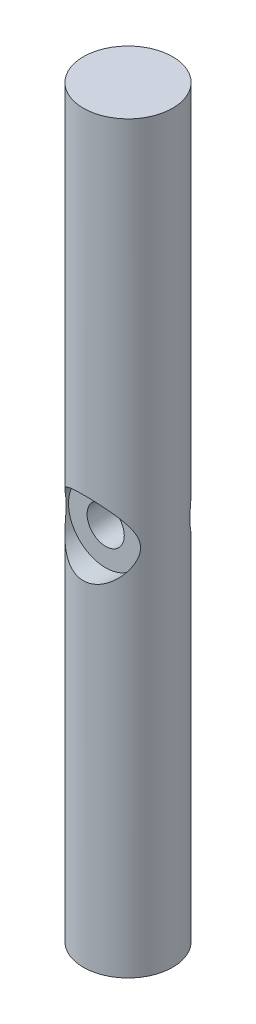
ISO-10303-21;
HEADER;
FILE_DESCRIPTION(('STEP AP214'),'2;1');
FILE_NAME('part.step','',(''),(''),'','','');
FILE_SCHEMA(('AUTOMOTIVE_DESIGN { 1 0 10303 214 1 1 1 1 }'));
ENDSEC;
DATA;
#1=APPLICATION_CONTEXT('core data for automotive mechanical design processes');
#2=APPLICATION_PROTOCOL_DEFINITION('international standard','automotive_design',2000,#1);
#3=PRODUCT_CONTEXT('',#1,'mechanical');
#4=PRODUCT('Part','Part','',(#3));
#5=PRODUCT_RELATED_PRODUCT_CATEGORY('part','',(#4));
#6=PRODUCT_DEFINITION_FORMATION('','',#4);
#7=PRODUCT_DEFINITION_CONTEXT('part definition',#1,'design');
#8=PRODUCT_DEFINITION('design','',#6,#7);
#9=PRODUCT_DEFINITION_SHAPE('','',#8);
#10=(LENGTH_UNIT() NAMED_UNIT(*) SI_UNIT(.MILLI.,.METRE.));
#11=(NAMED_UNIT(*) PLANE_ANGLE_UNIT() SI_UNIT($,.RADIAN.));
#12=(NAMED_UNIT(*) SI_UNIT($,.STERADIAN.) SOLID_ANGLE_UNIT());
#13=UNCERTAINTY_MEASURE_WITH_UNIT(LENGTH_MEASURE(1.E-05),#10,'distance_accuracy_value','');
#14=(GEOMETRIC_REPRESENTATION_CONTEXT(3) GLOBAL_UNCERTAINTY_ASSIGNED_CONTEXT((#13)) GLOBAL_UNIT_ASSIGNED_CONTEXT((#10,
#11,#12)) REPRESENTATION_CONTEXT('',''));
#15=CARTESIAN_POINT('',(0.,0.,0.));
#16=DIRECTION('',(0.,0.,1.));
#17=DIRECTION('',(1.,0.,0.));
#18=AXIS2_PLACEMENT_3D('',#15,#16,#17);
#19=CARTESIAN_POINT('',(0.,100.,0.));
#20=DIRECTION('',(0.,1.,0.));
#21=DIRECTION('',(0.,0.,1.));
#22=AXIS2_PLACEMENT_3D('',#19,#20,#21);
#23=PLANE('',#22);
#24=CARTESIAN_POINT('',(6.,100.,6.));
#25=DIRECTION('',(0.,1.,0.));
#26=DIRECTION('',(0.,0.,1.));
#27=AXIS2_PLACEMENT_3D('',#24,#25,#26);
#28=CIRCLE('',#27,6.);
#29=CARTESIAN_POINT('',(6.,100.,12.));
#30=VERTEX_POINT('',#29);
#31=EDGE_CURVE('E146',#30,#30,#28,.T.);
#32=ORIENTED_EDGE('',*,*,#31,.T.);
#33=EDGE_LOOP('',(#32));
#34=FACE_BOUND('',#33,.T.);
#35=ADVANCED_FACE('F71',(#34),#23,.T.);
#36=CARTESIAN_POINT('',(0.,0.,0.));
#37=DIRECTION('',(0.,1.,0.));
#38=DIRECTION('',(0.,0.,1.));
#39=AXIS2_PLACEMENT_3D('',#36,#37,#38);
#40=PLANE('',#39);
#41=CARTESIAN_POINT('',(6.,0.,6.));
#42=DIRECTION('',(0.,1.,0.));
#43=DIRECTION('',(0.,0.,1.));
#44=AXIS2_PLACEMENT_3D('',#41,#42,#43);
#45=CIRCLE('',#44,6.);
#46=CARTESIAN_POINT('',(6.,0.,12.));
#47=VERTEX_POINT('',#46);
#48=EDGE_CURVE('E150',#47,#47,#45,.T.);
#49=ORIENTED_EDGE('',*,*,#48,.F.);
#50=EDGE_LOOP('',(#49));
#51=FACE_BOUND('',#50,.T.);
#52=ADVANCED_FACE('F73',(#51),#40,.F.);
#53=CARTESIAN_POINT('',(6.,50.,3.));
#54=DIRECTION('',(0.,0.,-1.));
#55=DIRECTION('',(-1.,0.,0.));
#56=AXIS2_PLACEMENT_3D('',#53,#54,#55);
#57=CYLINDRICAL_SURFACE('',#56,5.);
#58=CARTESIAN_POINT('',(6.,50.,3.));
#59=DIRECTION('',(0.,0.,-1.));
#60=DIRECTION('',(-1.,0.,0.));
#61=AXIS2_PLACEMENT_3D('',#58,#59,#60);
#62=CIRCLE('',#61,5.);
#63=CARTESIAN_POINT('',(1.,50.,3.));
#64=VERTEX_POINT('',#63);
#65=EDGE_CURVE('E139',#64,#64,#62,.T.);
#66=ORIENTED_EDGE('',*,*,#65,.F.);
#67=EDGE_LOOP('',(#66));
#68=FACE_BOUND('',#67,.T.);
#69=CARTESIAN_POINT('',(6.,45.,0.));
#70=CARTESIAN_POINT('',(6.11878093363401,45.0000005008829,4.84350159422179E-07));
#71=CARTESIAN_POINT('',(6.2375683592415,45.0042401084941,0.00353482933203372));
#72=CARTESIAN_POINT('',(6.47412864397415,45.0211176735416,0.017588454695132));
#73=CARTESIAN_POINT('',(6.59190142806356,45.0337562467964,0.0281082472546861));
#74=CARTESIAN_POINT('',(6.82550627973061,45.0672056483976,0.0558959736865424));
#75=CARTESIAN_POINT('',(6.94133780937091,45.0880187041571,0.0731657468121904));
#76=CARTESIAN_POINT('',(7.17019562201528,45.1374518140673,0.114068844819479));
#77=CARTESIAN_POINT('',(7.2832206425207,45.1660753147121,0.137704978908681));
#78=CARTESIAN_POINT('',(7.61550544619961,45.2625959370231,0.217125150118607));
#79=CARTESIAN_POINT('',(7.82964125428179,45.3413908185691,0.281629431022766));
#80=CARTESIAN_POINT('',(8.23973656043758,45.5240503903227,0.429430658315391));
#81=CARTESIAN_POINT('',(8.43568958186601,45.6279239663817,0.512734264972656));
#82=CARTESIAN_POINT('',(8.74874934432862,45.8206823550778,0.664796974065804));
#83=CARTESIAN_POINT('',(8.87121824740682,45.9039467902522,0.729845487698135));
#84=CARTESIAN_POINT('',(9.10654669899643,46.0794251002487,0.865043929235763));
#85=CARTESIAN_POINT('',(9.21940637254956,46.1716388585829,0.93519379073688));
#86=CARTESIAN_POINT('',(9.43568818423124,46.3644669412424,1.07933092853949));
#87=CARTESIAN_POINT('',(9.53908407743886,46.4651032283089,1.15332803409519));
#88=CARTESIAN_POINT('',(9.73607907822589,46.6739929639915,1.30350681692629));
#89=CARTESIAN_POINT('',(9.82967941668524,46.7822454527129,1.37968821819334));
#90=CARTESIAN_POINT('',(10.0087253728694,47.0081315768427,1.53409062942224));
#91=CARTESIAN_POINT('',(10.0939892653652,47.125901170286,1.61232337693076));
#92=CARTESIAN_POINT('',(10.2543113919111,47.3690215239893,1.76759100042992));
#93=CARTESIAN_POINT('',(10.3293662085571,47.4943748026382,1.84462546770125));
#94=CARTESIAN_POINT('',(10.4688211983427,47.7525316309654,1.99498860632949));
#95=CARTESIAN_POINT('',(10.5332464785212,47.8853166028218,2.06832571757561));
#96=CARTESIAN_POINT('',(10.6510741464776,48.1588959044494,2.20844602844154));
#97=CARTESIAN_POINT('',(10.7044859263464,48.2996832781197,2.27523478665361));
#98=CARTESIAN_POINT('',(10.8038705596531,48.6033237769019,2.40416369743996));
#99=CARTESIAN_POINT('',(10.8486776675123,48.7670084480211,2.46528210818313));
#100=CARTESIAN_POINT('',(10.9220247680141,49.1038192006064,2.56812808875819));
#101=CARTESIAN_POINT('',(10.9506042450748,49.2769212326004,2.6099026790589));
#102=CARTESIAN_POINT('',(10.9798243968761,49.5423380553308,2.65311567837335));
#103=CARTESIAN_POINT('',(10.9872926117423,49.6323812235195,2.6642862879083));
#104=CARTESIAN_POINT('',(10.9973356513669,49.8133639156142,2.67934845290137));
#105=CARTESIAN_POINT('',(10.999910933684,49.9043033549067,2.68324068899018));
#106=CARTESIAN_POINT('',(11.0000845523571,50.0861951092195,2.68350292525564));
#107=CARTESIAN_POINT('',(10.9976828726122,50.1771474242806,2.6798729010973));
#108=CARTESIAN_POINT('',(10.9879770188618,50.3581996898119,2.6653095546694));
#109=CARTESIAN_POINT('',(10.9806722476827,50.4482995350995,2.65437534278485));
#110=CARTESIAN_POINT('',(10.9605577565747,50.6342904809577,2.62461673065045));
#111=CARTESIAN_POINT('',(10.947342877284,50.7300445970842,2.60521479286628));
#112=CARTESIAN_POINT('',(10.9157404443548,50.9190725634029,2.55961239255518));
#113=CARTESIAN_POINT('',(10.897349230926,51.012344607457,2.5334071209318));
#114=CARTESIAN_POINT('',(10.8348713075034,51.2882684493631,2.44625636332749));
#115=CARTESIAN_POINT('',(10.7835240733533,51.466645503479,2.3768456298222));
#116=CARTESIAN_POINT('',(10.6763222793292,51.7756807662667,2.23995128298252));
#117=CARTESIAN_POINT('',(10.6235519478118,51.9086226956886,2.17499204496804));
#118=CARTESIAN_POINT('',(10.5080868110164,52.1673034037985,2.03956168581629));
#119=CARTESIAN_POINT('',(10.4453861849328,52.293037898488,1.96908734424404));
#120=CARTESIAN_POINT('',(10.3104307309797,52.5376628982034,1.82508118184964));
#121=CARTESIAN_POINT('',(10.2381630820995,52.6565439062844,1.75154535053321));
#122=CARTESIAN_POINT('',(10.0843539722175,52.8874357008827,1.60347287483636));
#123=CARTESIAN_POINT('',(10.0028143779899,52.9994478633785,1.52893643457019));
#124=CARTESIAN_POINT('',(9.82600709063083,53.2222566250492,1.37658228022989));
#125=CARTESIAN_POINT('',(9.73024449657146,53.3326833744542,1.29879679593222));
#126=CARTESIAN_POINT('',(9.52850528029204,53.5455832442409,1.14554772254058));
#127=CARTESIAN_POINT('',(9.42252712316717,53.6480551652079,1.07008448462208));
#128=CARTESIAN_POINT('',(9.20058233592757,53.8442356250399,0.923196710771541));
#129=CARTESIAN_POINT('',(9.08463595506623,53.937961159114,0.851764453721393));
#130=CARTESIAN_POINT('',(8.84274836353463,54.115989122673,0.714342929363533));
#131=CARTESIAN_POINT('',(8.71680694483633,54.2002913559413,0.648353775402166));
#132=CARTESIAN_POINT('',(8.38822091711477,54.3988178647713,0.491441311157265));
#133=CARTESIAN_POINT('',(8.17921286095962,54.5063777359494,0.404963572695733));
#134=CARTESIAN_POINT('',(7.85124311861689,54.6461881999482,0.291555368625313));
#135=CARTESIAN_POINT('',(7.73952132838536,54.6892004634685,0.256473206861837));
#136=CARTESIAN_POINT('',(7.51168950648061,54.7675234995489,0.192352475615298));
#137=CARTESIAN_POINT('',(7.39557996047324,54.8028351215544,0.163313239562924));
#138=CARTESIAN_POINT('',(7.17502139352472,54.8611317895128,0.115242705554804));
#139=CARTESIAN_POINT('',(7.0710124904544,54.8851214539581,0.0954019749186499));
#140=CARTESIAN_POINT('',(6.86081945310425,54.9265055947709,0.0611177366046223));
#141=CARTESIAN_POINT('',(6.75463562577485,54.9439009951287,0.046673472776207));
#142=CARTESIAN_POINT('',(6.5407481281928,54.9718430985668,0.0234488693256074));
#143=CARTESIAN_POINT('',(6.43304438179078,54.9823894572501,0.0146688145224644));
#144=CARTESIAN_POINT('',(6.2168954090436,54.9964671039373,0.00294501791109575));
#145=CARTESIAN_POINT('',(6.10845041044629,55.0000004573205,-4.4222563879743E-07));
#146=CARTESIAN_POINT('',(5.881219066366,54.9999994991171,4.84350159533739E-07));
#147=CARTESIAN_POINT('',(5.7624316407585,54.9957598915059,0.00353482933203342));
#148=CARTESIAN_POINT('',(5.52587135602586,54.9788823264584,0.0175884546951318));
#149=CARTESIAN_POINT('',(5.40809857193644,54.9662437532036,0.0281082472546865));
#150=CARTESIAN_POINT('',(5.17449372026939,54.9327943516024,0.0558959736865425));
#151=CARTESIAN_POINT('',(5.0586621906291,54.9119812958429,0.0731657468121899));
#152=CARTESIAN_POINT('',(4.82980437798472,54.8625481859327,0.114068844819479));
#153=CARTESIAN_POINT('',(4.71677935747931,54.8339246852879,0.137704978908681));
#154=CARTESIAN_POINT('',(4.3844945538004,54.7374040629769,0.217125150118608));
#155=CARTESIAN_POINT('',(4.17035874571821,54.6586091814309,0.281629431022766));
#156=CARTESIAN_POINT('',(3.76026343956243,54.4759496096773,0.429430658315391));
#157=CARTESIAN_POINT('',(3.56431041813399,54.3720760336183,0.512734264972656));
#158=CARTESIAN_POINT('',(3.25125065567138,54.1793176449222,0.664796974065805));
#159=CARTESIAN_POINT('',(3.12878175259319,54.0960532097478,0.729845487698136));
#160=CARTESIAN_POINT('',(2.89345330100357,53.9205748997513,0.865043929235765));
#161=CARTESIAN_POINT('',(2.78059362745044,53.8283611414171,0.935193790736882));
#162=CARTESIAN_POINT('',(2.56431181576876,53.6355330587576,1.07933092853949));
#163=CARTESIAN_POINT('',(2.46091592256114,53.5348967716911,1.15332803409519));
#164=CARTESIAN_POINT('',(2.26392092177411,53.3260070360085,1.30350681692629));
#165=CARTESIAN_POINT('',(2.17032058331476,53.2177545472871,1.37968821819334));
#166=CARTESIAN_POINT('',(1.99127462713059,52.9918684231573,1.53409062942224));
#167=CARTESIAN_POINT('',(1.90601073463484,52.874098829714,1.61232337693076));
#168=CARTESIAN_POINT('',(1.74568860808886,52.6309784760107,1.76759100042992));
#169=CARTESIAN_POINT('',(1.67063379144295,52.5056251973618,1.84462546770125));
#170=CARTESIAN_POINT('',(1.53117880165729,52.2474683690346,1.99498860632949));
#171=CARTESIAN_POINT('',(1.46675352147876,52.1146833971782,2.06832571757561));
#172=CARTESIAN_POINT('',(1.34892585352241,51.8411040955506,2.20844602844154));
#173=CARTESIAN_POINT('',(1.29551407365358,51.7003167218803,2.27523478665361));
#174=CARTESIAN_POINT('',(1.19612944034693,51.3966762230981,2.40416369743996));
#175=CARTESIAN_POINT('',(1.15132233248769,51.2329915519789,2.46528210818312));
#176=CARTESIAN_POINT('',(1.0779752319859,50.8961807993936,2.56812808875818));
#177=CARTESIAN_POINT('',(1.04939575492525,50.7230787673996,2.6099026790589));
#178=CARTESIAN_POINT('',(1.02017560312392,50.4576619446692,2.65311567837334));
#179=CARTESIAN_POINT('',(1.01270738825772,50.3676187764806,2.66428628790829));
#180=CARTESIAN_POINT('',(1.00266434863308,50.1866360843858,2.67934845290136));
#181=CARTESIAN_POINT('',(1.000089066316,50.0956966450933,2.68324068899017));
#182=CARTESIAN_POINT('',(0.999915447642949,49.9138048907805,2.68350292525563));
#183=CARTESIAN_POINT('',(1.00231712738777,49.8228525757194,2.67987290109729));
#184=CARTESIAN_POINT('',(1.01202298113819,49.6418003101882,2.66530955466939));
#185=CARTESIAN_POINT('',(1.0193277523173,49.5517004649005,2.65437534278485));
#186=CARTESIAN_POINT('',(1.03944224342527,49.3657095190423,2.62461673065045));
#187=CARTESIAN_POINT('',(1.05265712271597,49.2699554029158,2.60521479286628));
#188=CARTESIAN_POINT('',(1.08425955564521,49.0809274365971,2.55961239255518));
#189=CARTESIAN_POINT('',(1.10265076907396,48.987655392543,2.53340712093179));
#190=CARTESIAN_POINT('',(1.16512869249657,48.7117315506369,2.44625636332748));
#191=CARTESIAN_POINT('',(1.21647592664673,48.533354496521,2.37684562982219));
#192=CARTESIAN_POINT('',(1.32367772067082,48.2243192337333,2.23995128298251));
#193=CARTESIAN_POINT('',(1.3764480521882,48.0913773043114,2.17499204496803));
#194=CARTESIAN_POINT('',(1.49191318898356,47.8326965962015,2.03956168581628));
#195=CARTESIAN_POINT('',(1.55461381506717,47.706962101512,1.96908734424403));
#196=CARTESIAN_POINT('',(1.68956926902029,47.4623371017966,1.82508118184963));
#197=CARTESIAN_POINT('',(1.76183691790047,47.3434560937156,1.7515453505332));
#198=CARTESIAN_POINT('',(1.91564602778254,47.1125642991173,1.60347287483636));
#199=CARTESIAN_POINT('',(1.99718562201007,47.0005521366215,1.52893643457019));
#200=CARTESIAN_POINT('',(2.17399290936918,46.7777433749508,1.37658228022988));
#201=CARTESIAN_POINT('',(2.26975550342856,46.6673166255458,1.29879679593221));
#202=CARTESIAN_POINT('',(2.47149471970797,46.4544167557591,1.14554772254058));
#203=CARTESIAN_POINT('',(2.57747287683284,46.3519448347921,1.07008448462207));
#204=CARTESIAN_POINT('',(2.79941766407244,46.1557643749601,0.923196710771536));
#205=CARTESIAN_POINT('',(2.91536404493378,46.062038840886,0.85176445372139));
#206=CARTESIAN_POINT('',(3.15725163646538,45.884010877327,0.71434292936353));
#207=CARTESIAN_POINT('',(3.28319305516368,45.7997086440587,0.648353775402163));
#208=CARTESIAN_POINT('',(3.61177908288524,45.6011821352287,0.491441311157262));
#209=CARTESIAN_POINT('',(3.82078713904039,45.4936222640506,0.404963572695732));
#210=CARTESIAN_POINT('',(4.14875688138311,45.3538118000518,0.291555368625313));
#211=CARTESIAN_POINT('',(4.26047867161464,45.3107995365315,0.256473206861836));
#212=CARTESIAN_POINT('',(4.48831049351939,45.2324765004511,0.192352475615297));
#213=CARTESIAN_POINT('',(4.60442003952677,45.1971648784456,0.163313239562923));
#214=CARTESIAN_POINT('',(4.82497860647529,45.1388682104872,0.115242705554803));
#215=CARTESIAN_POINT('',(4.92898750954561,45.1148785460419,0.0954019749186491));
#216=CARTESIAN_POINT('',(5.13918054689576,45.0734944052291,0.0611177366046213));
#217=CARTESIAN_POINT('',(5.24536437422516,45.0560990048713,0.0466734727762055));
#218=CARTESIAN_POINT('',(5.4592518718072,45.0281569014332,0.0234488693256068));
#219=CARTESIAN_POINT('',(5.56695561820923,45.0176105427499,0.0146688145224654));
#220=CARTESIAN_POINT('',(5.78310459095641,45.0035328960627,0.00294501791109738));
#221=CARTESIAN_POINT('',(5.89154958955372,44.9999995426795,-4.42225638183524E-07));
#222=CARTESIAN_POINT('',(6.,45.,0.));
#223=B_SPLINE_CURVE_WITH_KNOTS('',3,(#69,#70,#71,#72,#73,#74,#75,#76,#77,#78,#79,#80,#81,#82,
#83,#84,#85,#86,#87,#88,#89,#90,#91,#92,#93,#94,#95,#96,#97,#98,#99,#100,#101,#102,#103,#104,
#105,#106,#107,#108,#109,#110,#111,#112,#113,#114,#115,#116,#117,#118,#119,#120,#121,#122,#123,
#124,#125,#126,#127,#128,#129,#130,#131,#132,#133,#134,#135,#136,#137,#138,#139,#140,#141,#142,
#143,#144,#145,#146,#147,#148,#149,#150,#151,#152,#153,#154,#155,#156,#157,#158,#159,#160,#161,
#162,#163,#164,#165,#166,#167,#168,#169,#170,#171,#172,#173,#174,#175,#176,#177,#178,#179,#180,
#181,#182,#183,#184,#185,#186,#187,#188,#189,#190,#191,#192,#193,#194,#195,#196,#197,#198,#199,
#200,#201,#202,#203,#204,#205,#206,#207,#208,#209,#210,#211,#212,#213,#214,#215,#216,#217,#218,
#219,#220,#221,#222),.UNSPECIFIED.,.T.,.F.,(4,2,2,2,2,2,2,2,2,2,2,2,2,2,2,2,2,2,2,2,2,2,2,2,2,2,
2,2,2,2,2,2,2,2,2,2,2,2,2,2,2,2,2,2,2,2,2,2,2,2,2,2,2,2,2,2,2,2,2,2,2,2,2,2,2,2,2,2,2,2,2,2,2,2,
2,2,4),(0.,0.356226555864318,0.712479233415105,1.06882905142911,1.42533636997652,
2.13332621686175,2.84156728690972,3.32622203550014,3.81087047647468,4.29682461371089,
4.78271761390768,5.27755058606102,5.77254879398261,6.26636053476553,6.75974940518457,
7.29936257181059,7.83765708433252,8.11040808032879,8.38313356897979,8.65585993991643,
8.9286195336729,9.2239274303971,9.51944464352174,10.1116379078914,10.5823769058783,
11.053392863549,11.5250465553201,11.996605453904,12.4928228736986,12.989114967523,
13.4844217042861,13.9797387526384,14.7276466014447,15.1015309600069,15.4753740550965,
15.8007442312746,16.1260687996138,16.4514097252961,16.7766548215704,17.1328813774348,
17.4891340549856,17.8454838729996,18.201991191547,18.9099810384322,19.6182221084802,
20.1028768570706,20.5875252980451,21.0734794352814,21.5593724354781,22.0542054076315,
22.5492036155531,23.043015356336,23.536404226755,24.076017393381,24.614311905903,
24.8870629018992,25.1597883905502,25.4325147614869,25.7052743552434,26.0005822519675,
26.2960994650922,26.8882927294618,27.3590317274487,27.8300476851194,28.3017013768905,
28.7732602754745,29.2694776952691,29.7657697890934,30.2610765258565,30.7563935742088,
31.5043014230152,31.8781857815773,32.252028876667,32.5773990528451,32.9027236211842,
33.2280645468665,33.5533096431409),.UNSPECIFIED.);
#224=CARTESIAN_POINT('',(6.,45.,0.));
#225=VERTEX_POINT('',#224);
#226=EDGE_CURVE('E84',#225,#225,#223,.T.);
#227=ORIENTED_EDGE('',*,*,#226,.F.);
#228=EDGE_LOOP('',(#227));
#229=FACE_BOUND('',#228,.T.);
#230=ADVANCED_FACE('F99',(#68,#229),#57,.F.);
#231=CARTESIAN_POINT('',(6.,50.,9.));
#232=DIRECTION('',(0.,0.,1.));
#233=DIRECTION('',(1.,0.,0.));
#234=AXIS2_PLACEMENT_3D('',#231,#232,#233);
#235=CYLINDRICAL_SURFACE('',#234,5.);
#236=CARTESIAN_POINT('',(6.,50.,9.));
#237=DIRECTION('',(0.,0.,1.));
#238=DIRECTION('',(1.,0.,0.));
#239=AXIS2_PLACEMENT_3D('',#236,#237,#238);
#240=CIRCLE('',#239,5.);
#241=CARTESIAN_POINT('',(11.,50.,9.));
#242=VERTEX_POINT('',#241);
#243=EDGE_CURVE('E91',#242,#242,#240,.T.);
#244=ORIENTED_EDGE('',*,*,#243,.F.);
#245=EDGE_LOOP('',(#244));
#246=FACE_BOUND('',#245,.T.);
#247=CARTESIAN_POINT('',(6.,45.,12.));
#248=CARTESIAN_POINT('',(5.881219066366,45.0000005008829,11.9999995156498));
#249=CARTESIAN_POINT('',(5.7624316407585,45.0042401084941,11.996465170668));
#250=CARTESIAN_POINT('',(5.52587135602586,45.0211176735416,11.9824115453049));
#251=CARTESIAN_POINT('',(5.40809857193644,45.0337562467964,11.9718917527453));
#252=CARTESIAN_POINT('',(5.17449372026939,45.0672056483976,11.9441040263135));
#253=CARTESIAN_POINT('',(5.0586621906291,45.0880187041571,11.9268342531878));
#254=CARTESIAN_POINT('',(4.82980437798473,45.1374518140673,11.8859311551805));
#255=CARTESIAN_POINT('',(4.7167793574793,45.1660753147121,11.8622950210913));
#256=CARTESIAN_POINT('',(4.3844945538004,45.2625959370231,11.7828748498814));
#257=CARTESIAN_POINT('',(4.17035874571821,45.3413908185691,11.7183705689772));
#258=CARTESIAN_POINT('',(3.76026343956243,45.5240503903227,11.5705693416846));
#259=CARTESIAN_POINT('',(3.56431041813399,45.6279239663817,11.4872657350273));
#260=CARTESIAN_POINT('',(3.25125065567138,45.8206823550778,11.3352030259342));
#261=CARTESIAN_POINT('',(3.12878175259318,45.9039467902522,11.2701545123019));
#262=CARTESIAN_POINT('',(2.89345330100357,46.0794251002488,11.1349560707642));
#263=CARTESIAN_POINT('',(2.78059362745044,46.1716388585829,11.0648062092631));
#264=CARTESIAN_POINT('',(2.56431181576876,46.3644669412424,10.9206690714605));
#265=CARTESIAN_POINT('',(2.46091592256115,46.4651032283089,10.8466719659048));
#266=CARTESIAN_POINT('',(2.26392092177411,46.6739929639915,10.6964931830737));
#267=CARTESIAN_POINT('',(2.17032058331476,46.7822454527129,10.6203117818067));
#268=CARTESIAN_POINT('',(1.99127462713059,47.0081315768427,10.4659093705778));
#269=CARTESIAN_POINT('',(1.90601073463483,47.125901170286,10.3876766230692));
#270=CARTESIAN_POINT('',(1.74568860808886,47.3690215239893,10.2324089995701));
#271=CARTESIAN_POINT('',(1.67063379144295,47.4943748026382,10.1553745322987));
#272=CARTESIAN_POINT('',(1.53117880165729,47.7525316309654,10.0050113936705));
#273=CARTESIAN_POINT('',(1.46675352147876,47.8853166028218,9.93167428242439));
#274=CARTESIAN_POINT('',(1.34892585352241,48.1588959044494,9.79155397155846));
#275=CARTESIAN_POINT('',(1.29551407365358,48.2996832781197,9.72476521334639));
#276=CARTESIAN_POINT('',(1.19612944034693,48.6033237769019,9.59583630256004));
#277=CARTESIAN_POINT('',(1.15132233248769,48.7670084480211,9.53471789181688));
#278=CARTESIAN_POINT('',(1.0779752319859,49.1038192006064,9.43187191124182));
#279=CARTESIAN_POINT('',(1.04939575492525,49.2769212326004,9.39009732094111));
#280=CARTESIAN_POINT('',(1.02017560312392,49.5423380553308,9.34688432162666));
#281=CARTESIAN_POINT('',(1.01270738825772,49.6323812235195,9.33571371209171));
#282=CARTESIAN_POINT('',(1.00266434863308,49.8133639156142,9.32065154709864));
#283=CARTESIAN_POINT('',(1.000089066316,49.9043033549067,9.31675931100983));
#284=CARTESIAN_POINT('',(0.99991544764295,50.0861951092195,9.31649707474437));
#285=CARTESIAN_POINT('',(1.00231712738777,50.1771474242806,9.32012709890271));
#286=CARTESIAN_POINT('',(1.0120229811382,50.3581996898119,9.33469044533061));
#287=CARTESIAN_POINT('',(1.0193277523173,50.4482995350995,9.34562465721516));
#288=CARTESIAN_POINT('',(1.03944224342527,50.6342904809578,9.37538326934955));
#289=CARTESIAN_POINT('',(1.05265712271597,50.7300445970842,9.39478520713373));
#290=CARTESIAN_POINT('',(1.08425955564522,50.9190725634029,9.44038760744483));
#291=CARTESIAN_POINT('',(1.10265076907396,51.012344607457,9.46659287906821));
#292=CARTESIAN_POINT('',(1.16512869249657,51.2882684493631,9.55374363667252));
#293=CARTESIAN_POINT('',(1.21647592664673,51.4666455034791,9.62315437017782));
#294=CARTESIAN_POINT('',(1.32367772067082,51.7756807662667,9.7600487170175));
#295=CARTESIAN_POINT('',(1.37644805218821,51.9086226956887,9.82500795503197));
#296=CARTESIAN_POINT('',(1.49191318898356,52.1673034037985,9.96043831418372));
#297=CARTESIAN_POINT('',(1.55461381506718,52.293037898488,10.030912655756));
#298=CARTESIAN_POINT('',(1.6895692690203,52.5376628982034,10.1749188181504));
#299=CARTESIAN_POINT('',(1.76183691790048,52.6565439062844,10.2484546494668));
#300=CARTESIAN_POINT('',(1.91564602778256,52.8874357008827,10.3965271251637));
#301=CARTESIAN_POINT('',(1.99718562201009,52.9994478633785,10.4710635654298));
#302=CARTESIAN_POINT('',(2.17399290936919,53.2222566250492,10.6234177197701));
#303=CARTESIAN_POINT('',(2.26975550342857,53.3326833744542,10.7012032040678));
#304=CARTESIAN_POINT('',(2.47149471970798,53.5455832442409,10.8544522774594));
#305=CARTESIAN_POINT('',(2.57747287683286,53.6480551652079,10.9299155153779));
#306=CARTESIAN_POINT('',(2.79941766407246,53.8442356250399,11.0768032892285));
#307=CARTESIAN_POINT('',(2.9153640449338,53.9379611591141,11.1482355462786));
#308=CARTESIAN_POINT('',(3.1572516364654,54.115989122673,11.2856570706365));
#309=CARTESIAN_POINT('',(3.2831930551637,54.2002913559413,11.3516462245978));
#310=CARTESIAN_POINT('',(3.61177908288526,54.3988178647713,11.5085586888427));
#311=CARTESIAN_POINT('',(3.82078713904041,54.5063777359494,11.5950364273043));
#312=CARTESIAN_POINT('',(4.14875688138313,54.6461881999482,11.7084446313747));
#313=CARTESIAN_POINT('',(4.26047867161466,54.6892004634685,11.7435267931382));
#314=CARTESIAN_POINT('',(4.48831049351941,54.7675234995489,11.8076475243847));
#315=CARTESIAN_POINT('',(4.60442003952678,54.8028351215544,11.8366867604371));
#316=CARTESIAN_POINT('',(4.8249786064753,54.8611317895128,11.8847572944452));
#317=CARTESIAN_POINT('',(4.92898750954562,54.8851214539581,11.9045980250814));
#318=CARTESIAN_POINT('',(5.13918054689577,54.9265055947709,11.9388822633954));
#319=CARTESIAN_POINT('',(5.24536437422516,54.9439009951287,11.9533265272238));
#320=CARTESIAN_POINT('',(5.45925187180721,54.9718430985668,11.9765511306744));
#321=CARTESIAN_POINT('',(5.56695561820923,54.9823894572501,11.9853311854775));
#322=CARTESIAN_POINT('',(5.78310459095641,54.9964671039373,11.9970549820889));
#323=CARTESIAN_POINT('',(5.89154958955372,55.0000004573205,12.0000004422256));
#324=CARTESIAN_POINT('',(6.118780933634,54.9999994991171,11.9999995156498));
#325=CARTESIAN_POINT('',(6.2375683592415,54.9957598915059,11.996465170668));
#326=CARTESIAN_POINT('',(6.47412864397414,54.9788823264584,11.9824115453049));
#327=CARTESIAN_POINT('',(6.59190142806356,54.9662437532036,11.9718917527453));
#328=CARTESIAN_POINT('',(6.82550627973061,54.9327943516024,11.9441040263135));
#329=CARTESIAN_POINT('',(6.9413378093709,54.9119812958429,11.9268342531878));
#330=CARTESIAN_POINT('',(7.17019562201528,54.8625481859327,11.8859311551805));
#331=CARTESIAN_POINT('',(7.2832206425207,54.8339246852879,11.8622950210913));
#332=CARTESIAN_POINT('',(7.61550544619961,54.7374040629769,11.7828748498814));
#333=CARTESIAN_POINT('',(7.82964125428179,54.6586091814309,11.7183705689772));
#334=CARTESIAN_POINT('',(8.23973656043758,54.4759496096773,11.5705693416846));
#335=CARTESIAN_POINT('',(8.43568958186601,54.3720760336183,11.4872657350273));
#336=CARTESIAN_POINT('',(8.74874934432862,54.1793176449222,11.3352030259342));
#337=CARTESIAN_POINT('',(8.87121824740682,54.0960532097478,11.2701545123019));
#338=CARTESIAN_POINT('',(9.10654669899643,53.9205748997513,11.1349560707642));
#339=CARTESIAN_POINT('',(9.21940637254956,53.8283611414171,11.0648062092631));
#340=CARTESIAN_POINT('',(9.43568818423124,53.6355330587576,10.9206690714605));
#341=CARTESIAN_POINT('',(9.53908407743885,53.5348967716911,10.8466719659048));
#342=CARTESIAN_POINT('',(9.73607907822589,53.3260070360085,10.6964931830737));
#343=CARTESIAN_POINT('',(9.82967941668524,53.2177545472871,10.6203117818067));
#344=CARTESIAN_POINT('',(10.0087253728694,52.9918684231573,10.4659093705778));
#345=CARTESIAN_POINT('',(10.0939892653652,52.874098829714,10.3876766230692));
#346=CARTESIAN_POINT('',(10.2543113919111,52.6309784760107,10.2324089995701));
#347=CARTESIAN_POINT('',(10.3293662085571,52.5056251973618,10.1553745322988));
#348=CARTESIAN_POINT('',(10.4688211983427,52.2474683690346,10.0050113936705));
#349=CARTESIAN_POINT('',(10.5332464785212,52.1146833971782,9.93167428242439));
#350=CARTESIAN_POINT('',(10.6510741464776,51.8411040955506,9.79155397155846));
#351=CARTESIAN_POINT('',(10.7044859263464,51.7003167218803,9.72476521334639));
#352=CARTESIAN_POINT('',(10.8038705596531,51.3966762230981,9.59583630256004));
#353=CARTESIAN_POINT('',(10.8486776675123,51.2329915519789,9.53471789181688));
#354=CARTESIAN_POINT('',(10.9220247680141,50.8961807993937,9.43187191124182));
#355=CARTESIAN_POINT('',(10.9506042450748,50.7230787673996,9.39009732094111));
#356=CARTESIAN_POINT('',(10.9798243968761,50.4576619446693,9.34688432162666));
#357=CARTESIAN_POINT('',(10.9872926117423,50.3676187764806,9.3357137120917));
#358=CARTESIAN_POINT('',(10.9973356513669,50.1866360843858,9.32065154709863));
#359=CARTESIAN_POINT('',(10.999910933684,50.0956966450933,9.31675931100983));
#360=CARTESIAN_POINT('',(11.0000845523571,49.9138048907805,9.31649707474437));
#361=CARTESIAN_POINT('',(10.9976828726122,49.8228525757194,9.32012709890271));
#362=CARTESIAN_POINT('',(10.9879770188618,49.6418003101882,9.33469044533061));
#363=CARTESIAN_POINT('',(10.9806722476827,49.5517004649005,9.34562465721515));
#364=CARTESIAN_POINT('',(10.9605577565747,49.3657095190423,9.37538326934955));
#365=CARTESIAN_POINT('',(10.947342877284,49.2699554029158,9.39478520713372));
#366=CARTESIAN_POINT('',(10.9157404443548,49.0809274365971,9.44038760744482));
#367=CARTESIAN_POINT('',(10.897349230926,48.987655392543,9.4665928790682));
#368=CARTESIAN_POINT('',(10.8348713075034,48.711731550637,9.55374363667251));
#369=CARTESIAN_POINT('',(10.7835240733533,48.533354496521,9.6231543701778));
#370=CARTESIAN_POINT('',(10.6763222793292,48.2243192337333,9.76004871701748));
#371=CARTESIAN_POINT('',(10.6235519478118,48.0913773043114,9.82500795503196));
#372=CARTESIAN_POINT('',(10.5080868110164,47.8326965962015,9.96043831418371));
#373=CARTESIAN_POINT('',(10.4453861849328,47.706962101512,10.030912655756));
#374=CARTESIAN_POINT('',(10.3104307309797,47.4623371017966,10.1749188181504));
#375=CARTESIAN_POINT('',(10.2381630820995,47.3434560937156,10.2484546494668));
#376=CARTESIAN_POINT('',(10.0843539722175,47.1125642991173,10.3965271251636));
#377=CARTESIAN_POINT('',(10.0028143779899,47.0005521366215,10.4710635654298));
#378=CARTESIAN_POINT('',(9.82600709063082,46.7777433749508,10.6234177197701));
#379=CARTESIAN_POINT('',(9.73024449657145,46.6673166255458,10.7012032040678));
#380=CARTESIAN_POINT('',(9.52850528029203,46.4544167557591,10.8544522774594));
#381=CARTESIAN_POINT('',(9.42252712316716,46.3519448347921,10.9299155153779));
#382=CARTESIAN_POINT('',(9.20058233592756,46.1557643749601,11.0768032892285));
#383=CARTESIAN_POINT('',(9.08463595506622,46.062038840886,11.1482355462786));
#384=CARTESIAN_POINT('',(8.84274836353462,45.8840108773271,11.2856570706365));
#385=CARTESIAN_POINT('',(8.71680694483633,45.7997086440587,11.3516462245978));
#386=CARTESIAN_POINT('',(8.38822091711476,45.6011821352287,11.5085586888427));
#387=CARTESIAN_POINT('',(8.1792128609596,45.4936222640506,11.5950364273043));
#388=CARTESIAN_POINT('',(7.85124311861688,45.3538118000518,11.7084446313747));
#389=CARTESIAN_POINT('',(7.73952132838535,45.3107995365315,11.7435267931382));
#390=CARTESIAN_POINT('',(7.51168950648061,45.2324765004511,11.8076475243847));
#391=CARTESIAN_POINT('',(7.39557996047324,45.1971648784456,11.8366867604371));
#392=CARTESIAN_POINT('',(7.17502139352471,45.1388682104872,11.8847572944452));
#393=CARTESIAN_POINT('',(7.07101249045439,45.1148785460419,11.9045980250814));
#394=CARTESIAN_POINT('',(6.86081945310424,45.0734944052291,11.9388822633954));
#395=CARTESIAN_POINT('',(6.75463562577485,45.0560990048713,11.9533265272238));
#396=CARTESIAN_POINT('',(6.5407481281928,45.0281569014332,11.9765511306744));
#397=CARTESIAN_POINT('',(6.43304438179078,45.0176105427499,11.9853311854775));
#398=CARTESIAN_POINT('',(6.21689540904359,45.0035328960627,11.9970549820889));
#399=CARTESIAN_POINT('',(6.10845041044628,44.9999995426795,12.0000004422256));
#400=CARTESIAN_POINT('',(6.,45.,12.));
#401=B_SPLINE_CURVE_WITH_KNOTS('',3,(#247,#248,#249,#250,#251,#252,#253,#254,#255,#256,#257,
#258,#259,#260,#261,#262,#263,#264,#265,#266,#267,#268,#269,#270,#271,#272,#273,#274,#275,#276,
#277,#278,#279,#280,#281,#282,#283,#284,#285,#286,#287,#288,#289,#290,#291,#292,#293,#294,#295,
#296,#297,#298,#299,#300,#301,#302,#303,#304,#305,#306,#307,#308,#309,#310,#311,#312,#313,#314,
#315,#316,#317,#318,#319,#320,#321,#322,#323,#324,#325,#326,#327,#328,#329,#330,#331,#332,#333,
#334,#335,#336,#337,#338,#339,#340,#341,#342,#343,#344,#345,#346,#347,#348,#349,#350,#351,#352,
#353,#354,#355,#356,#357,#358,#359,#360,#361,#362,#363,#364,#365,#366,#367,#368,#369,#370,#371,
#372,#373,#374,#375,#376,#377,#378,#379,#380,#381,#382,#383,#384,#385,#386,#387,#388,#389,#390,
#391,#392,#393,#394,#395,#396,#397,#398,#399,#400),.UNSPECIFIED.,.T.,.F.,(4,2,2,2,2,2,2,2,2,2,2,
2,2,2,2,2,2,2,2,2,2,2,2,2,2,2,2,2,2,2,2,2,2,2,2,2,2,2,2,2,2,2,2,2,2,2,2,2,2,2,2,2,2,2,2,2,2,2,2,
2,2,2,2,2,2,2,2,2,2,2,2,2,2,2,2,2,4),(0.,0.356226555864318,0.712479233415104,1.06882905142911,
1.42533636997652,2.13332621686175,2.84156728690972,3.32622203550015,3.81087047647469,
4.2968246137109,4.78271761390769,5.27755058606103,5.77254879398262,6.26636053476554,
6.75974940518457,7.29936257181058,7.83765708433252,8.11040808032879,8.38313356897979,
8.65585993991643,8.9286195336729,9.22392743039709,9.51944464352174,10.1116379078914,
10.5823769058783,11.053392863549,11.5250465553201,11.9966054539041,12.4928228736987,
12.989114967523,13.4844217042861,13.9797387526384,14.7276466014447,15.1015309600069,
15.4753740550965,15.8007442312746,16.1260687996137,16.4514097252961,16.7766548215704,
17.1328813774347,17.4891340549855,17.8454838729995,18.201991191547,18.9099810384322,
19.6182221084802,20.1028768570706,20.5875252980451,21.0734794352813,21.5593724354781,
22.0542054076315,22.549203615553,23.043015356336,23.536404226755,24.076017393381,
24.614311905903,24.8870629018992,25.1597883905502,25.4325147614869,25.7052743552433,
26.0005822519675,26.2960994650922,26.8882927294618,27.3590317274487,27.8300476851194,
28.3017013768905,28.7732602754745,29.2694776952691,29.7657697890934,30.2610765258565,
30.7563935742088,31.5043014230152,31.8781857815773,32.2520288766669,32.5773990528451,
32.9027236211842,33.2280645468665,33.5533096431409),.UNSPECIFIED.);
#402=CARTESIAN_POINT('',(6.,45.,12.));
#403=VERTEX_POINT('',#402);
#404=EDGE_CURVE('E11',#403,#403,#401,.T.);
#405=ORIENTED_EDGE('',*,*,#404,.F.);
#406=EDGE_LOOP('',(#405));
#407=FACE_BOUND('',#406,.T.);
#408=ADVANCED_FACE('F126',(#246,#407),#235,.F.);
#409=CARTESIAN_POINT('',(6.,50.,-0.000999999999999265));
#410=DIRECTION('',(0.,0.,1.));
#411=DIRECTION('',(1.,0.,0.));
#412=AXIS2_PLACEMENT_3D('',#409,#410,#411);
#413=CYLINDRICAL_SURFACE('',#412,2.5);
#414=CARTESIAN_POINT('',(6.,50.,9.));
#415=DIRECTION('',(0.,0.,1.));
#416=DIRECTION('',(1.,0.,0.));
#417=AXIS2_PLACEMENT_3D('',#414,#415,#416);
#418=CIRCLE('',#417,2.5);
#419=CARTESIAN_POINT('',(8.5,50.,9.));
#420=VERTEX_POINT('',#419);
#421=EDGE_CURVE('E90',#420,#420,#418,.F.);
#422=ORIENTED_EDGE('',*,*,#421,.F.);
#423=EDGE_LOOP('',(#422));
#424=FACE_BOUND('',#423,.T.);
#425=CARTESIAN_POINT('',(6.,50.,3.));
#426=DIRECTION('',(0.,0.,-1.));
#427=DIRECTION('',(-1.,0.,0.));
#428=AXIS2_PLACEMENT_3D('',#425,#426,#427);
#429=CIRCLE('',#428,2.5);
#430=CARTESIAN_POINT('',(3.5,50.,3.));
#431=VERTEX_POINT('',#430);
#432=EDGE_CURVE('E142',#431,#431,#429,.T.);
#433=ORIENTED_EDGE('',*,*,#432,.T.);
#434=EDGE_LOOP('',(#433));
#435=FACE_BOUND('',#434,.T.);
#436=ADVANCED_FACE('F117',(#424,#435),#413,.F.);
#437=CARTESIAN_POINT('',(6.,50.,9.));
#438=DIRECTION('',(0.,0.,1.));
#439=DIRECTION('',(1.,0.,0.));
#440=AXIS2_PLACEMENT_3D('',#437,#438,#439);
#441=PLANE('',#440);
#442=ORIENTED_EDGE('',*,*,#243,.T.);
#443=EDGE_LOOP('',(#442));
#444=FACE_BOUND('',#443,.T.);
#445=ORIENTED_EDGE('',*,*,#421,.T.);
#446=EDGE_LOOP('',(#445));
#447=FACE_BOUND('',#446,.T.);
#448=ADVANCED_FACE('F109',(#444,#447),#441,.T.);
#449=CARTESIAN_POINT('',(6.,50.,3.));
#450=DIRECTION('',(0.,0.,-1.));
#451=DIRECTION('',(-1.,0.,0.));
#452=AXIS2_PLACEMENT_3D('',#449,#450,#451);
#453=PLANE('',#452);
#454=ORIENTED_EDGE('',*,*,#432,.F.);
#455=EDGE_LOOP('',(#454));
#456=FACE_BOUND('',#455,.T.);
#457=ORIENTED_EDGE('',*,*,#65,.T.);
#458=EDGE_LOOP('',(#457));
#459=FACE_BOUND('',#458,.T.);
#460=ADVANCED_FACE('F110',(#456,#459),#453,.T.);
#461=CARTESIAN_POINT('',(6.,0.,6.));
#462=DIRECTION('',(0.,1.,0.));
#463=DIRECTION('',(0.,0.,1.));
#464=AXIS2_PLACEMENT_3D('',#461,#462,#463);
#465=CYLINDRICAL_SURFACE('',#464,6.);
#466=ORIENTED_EDGE('',*,*,#226,.T.);
#467=EDGE_LOOP('',(#466));
#468=FACE_BOUND('',#467,.T.);
#469=ORIENTED_EDGE('',*,*,#31,.F.);
#470=EDGE_LOOP('',(#469));
#471=FACE_BOUND('',#470,.T.);
#472=ORIENTED_EDGE('',*,*,#404,.T.);
#473=EDGE_LOOP('',(#472));
#474=FACE_BOUND('',#473,.T.);
#475=ORIENTED_EDGE('',*,*,#48,.T.);
#476=EDGE_LOOP('',(#475));
#477=FACE_BOUND('',#476,.T.);
#478=ADVANCED_FACE('F102',(#468,#471,#474,#477),#465,.T.);
#479=CLOSED_SHELL('',(#35,#52,#230,#408,#436,#448,#460,#478));
#480=MANIFOLD_SOLID_BREP('B2',#479);
#481=ADVANCED_BREP_SHAPE_REPRESENTATION('',(#18,#480),#14);
#482=SHAPE_DEFINITION_REPRESENTATION(#9,#481);
ENDSEC;
END-ISO-10303-21;
